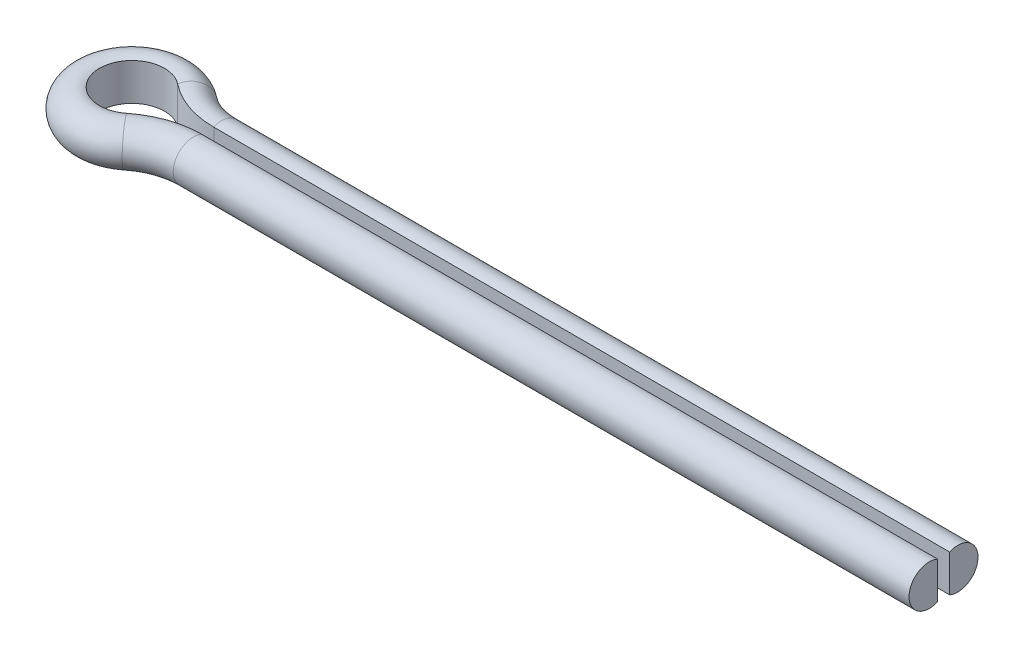
ISO-10303-21;
HEADER;
FILE_DESCRIPTION(('STEP AP214'),'2;1');
FILE_NAME('part.step','',(''),(''),'','','');
FILE_SCHEMA(('AUTOMOTIVE_DESIGN { 1 0 10303 214 1 1 1 1 }'));
ENDSEC;
DATA;
#1=APPLICATION_CONTEXT('core data for automotive mechanical design processes');
#2=APPLICATION_PROTOCOL_DEFINITION('international standard','automotive_design',2000,#1);
#3=PRODUCT_CONTEXT('',#1,'mechanical');
#4=PRODUCT('Part','Part','',(#3));
#5=PRODUCT_RELATED_PRODUCT_CATEGORY('part','',(#4));
#6=PRODUCT_DEFINITION_FORMATION('','',#4);
#7=PRODUCT_DEFINITION_CONTEXT('part definition',#1,'design');
#8=PRODUCT_DEFINITION('design','',#6,#7);
#9=PRODUCT_DEFINITION_SHAPE('','',#8);
#10=(LENGTH_UNIT() NAMED_UNIT(*) SI_UNIT(.MILLI.,.METRE.));
#11=(NAMED_UNIT(*) PLANE_ANGLE_UNIT() SI_UNIT($,.RADIAN.));
#12=(NAMED_UNIT(*) SI_UNIT($,.STERADIAN.) SOLID_ANGLE_UNIT());
#13=UNCERTAINTY_MEASURE_WITH_UNIT(LENGTH_MEASURE(1.E-05),#10,'distance_accuracy_value','');
#14=(GEOMETRIC_REPRESENTATION_CONTEXT(3) GLOBAL_UNCERTAINTY_ASSIGNED_CONTEXT((#13)) GLOBAL_UNIT_ASSIGNED_CONTEXT((#10,
#11,#12)) REPRESENTATION_CONTEXT('',''));
#15=CARTESIAN_POINT('',(0.,0.,0.));
#16=DIRECTION('',(0.,0.,1.));
#17=DIRECTION('',(1.,0.,0.));
#18=AXIS2_PLACEMENT_3D('',#15,#16,#17);
#19=CARTESIAN_POINT('',(100.,0.,1.75));
#20=DIRECTION('',(-1.,0.,0.));
#21=DIRECTION('',(0.,0.,1.));
#22=AXIS2_PLACEMENT_3D('',#19,#20,#21);
#23=PLANE('',#22);
#24=CARTESIAN_POINT('',(100.,0.,1.75));
#25=DIRECTION('',(-1.,0.,0.));
#26=DIRECTION('',(0.,0.,1.));
#27=AXIS2_PLACEMENT_3D('',#24,#25,#26);
#28=CIRCLE('',#27,2.5);
#29=CARTESIAN_POINT('',(100.,-2.29128784747792,0.749999999999998));
#30=VERTEX_POINT('',#29);
#31=CARTESIAN_POINT('',(100.,2.29128784747792,0.749999999999998));
#32=VERTEX_POINT('',#31);
#33=EDGE_CURVE('E86',#30,#32,#28,.T.);
#34=ORIENTED_EDGE('',*,*,#33,.F.);
#35=DIRECTION('',(0.,-1.,0.));
#36=VECTOR('',#35,1.);
#37=CARTESIAN_POINT('',(100.,-2.29128784747792,0.749999999999998));
#38=LINE('',#37,#36);
#39=EDGE_CURVE('E88',#32,#30,#38,.T.);
#40=ORIENTED_EDGE('',*,*,#39,.F.);
#41=EDGE_LOOP('',(#34,#40));
#42=FACE_BOUND('',#41,.T.);
#43=ADVANCED_FACE('F39',(#42),#23,.F.);
#44=CARTESIAN_POINT('',(100.,0.,-1.75));
#45=DIRECTION('',(1.,0.,0.));
#46=DIRECTION('',(0.,0.,-1.));
#47=AXIS2_PLACEMENT_3D('',#44,#45,#46);
#48=PLANE('',#47);
#49=CARTESIAN_POINT('',(100.,0.,-1.75));
#50=DIRECTION('',(1.,0.,0.));
#51=DIRECTION('',(0.,0.,-1.));
#52=AXIS2_PLACEMENT_3D('',#49,#50,#51);
#53=CIRCLE('',#52,2.5);
#54=CARTESIAN_POINT('',(100.,-2.29128784747792,-0.749999999999998));
#55=VERTEX_POINT('',#54);
#56=CARTESIAN_POINT('',(100.,2.29128784747792,-0.749999999999998));
#57=VERTEX_POINT('',#56);
#58=EDGE_CURVE('E52',#55,#57,#53,.T.);
#59=ORIENTED_EDGE('',*,*,#58,.T.);
#60=DIRECTION('',(0.,-1.,0.));
#61=VECTOR('',#60,1.);
#62=CARTESIAN_POINT('',(100.,-2.29128784747792,-0.749999999999998));
#63=LINE('',#62,#61);
#64=EDGE_CURVE('E11',#57,#55,#63,.T.);
#65=ORIENTED_EDGE('',*,*,#64,.T.);
#66=EDGE_LOOP('',(#59,#65));
#67=FACE_BOUND('',#66,.T.);
#68=ADVANCED_FACE('F212',(#67),#48,.T.);
#69=CARTESIAN_POINT('',(100.,0.,1.75));
#70=DIRECTION('',(-1.,0.,0.));
#71=DIRECTION('',(0.,0.,1.));
#72=AXIS2_PLACEMENT_3D('',#69,#70,#71);
#73=CYLINDRICAL_SURFACE('',#72,2.5);
#74=DIRECTION('',(-1.,0.,0.));
#75=VECTOR('',#74,1.);
#76=CARTESIAN_POINT('',(100.,2.29128784747792,0.749999999999998));
#77=LINE('',#76,#75);
#78=CARTESIAN_POINT('',(9.32402809948575,2.29128784747792,0.75));
#79=VERTEX_POINT('',#78);
#80=EDGE_CURVE('E100',#32,#79,#77,.T.);
#81=ORIENTED_EDGE('',*,*,#80,.T.);
#82=CARTESIAN_POINT('',(9.32402809948575,0.,1.75));
#83=DIRECTION('',(-1.,0.,0.));
#84=DIRECTION('',(0.,0.,1.));
#85=AXIS2_PLACEMENT_3D('',#82,#83,#84);
#86=CIRCLE('',#85,2.5);
#87=CARTESIAN_POINT('',(9.32402809948575,-2.29128784747792,0.75));
#88=VERTEX_POINT('',#87);
#89=EDGE_CURVE('E106',#88,#79,#86,.T.);
#90=ORIENTED_EDGE('',*,*,#89,.F.);
#91=DIRECTION('',(-1.,0.,0.));
#92=VECTOR('',#91,1.);
#93=CARTESIAN_POINT('',(100.,-2.29128784747792,0.749999999999998));
#94=LINE('',#93,#92);
#95=EDGE_CURVE('E99',#30,#88,#94,.T.);
#96=ORIENTED_EDGE('',*,*,#95,.F.);
#97=ORIENTED_EDGE('',*,*,#33,.T.);
#98=EDGE_LOOP('',(#81,#90,#96,#97));
#99=FACE_BOUND('',#98,.T.);
#100=ADVANCED_FACE('F104',(#99),#73,.T.);
#101=CARTESIAN_POINT('',(100.,-2.29128784747792,0.749999999999998));
#102=DIRECTION('',(0.,0.,-1.));
#103=DIRECTION('',(-1.,0.,0.));
#104=AXIS2_PLACEMENT_3D('',#101,#102,#103);
#105=PLANE('',#104);
#106=DIRECTION('',(0.,-1.,0.));
#107=VECTOR('',#106,1.);
#108=CARTESIAN_POINT('',(9.32402809948575,-2.29128784747792,0.75));
#109=LINE('',#108,#107);
#110=EDGE_CURVE('E126',#79,#88,#109,.T.);
#111=ORIENTED_EDGE('',*,*,#110,.F.);
#112=ORIENTED_EDGE('',*,*,#80,.F.);
#113=ORIENTED_EDGE('',*,*,#39,.T.);
#114=ORIENTED_EDGE('',*,*,#95,.T.);
#115=EDGE_LOOP('',(#111,#112,#113,#114));
#116=FACE_BOUND('',#115,.T.);
#117=ADVANCED_FACE('F98',(#116),#105,.T.);
#118=CARTESIAN_POINT('',(9.32402809948576,0.,11.75));
#119=DIRECTION('',(0.,1.,0.));
#120=DIRECTION('',(0.,0.,1.));
#121=AXIS2_PLACEMENT_3D('',#118,#119,#120);
#122=TOROIDAL_SURFACE('',#121,10.,2.5);
#123=CARTESIAN_POINT('',(9.32402809948576,2.29128784747792,11.75));
#124=DIRECTION('',(0.,1.,0.));
#125=DIRECTION('',(0.,0.,-1.));
#126=AXIS2_PLACEMENT_3D('',#123,#124,#125);
#127=CIRCLE('',#126,11.);
#128=CARTESIAN_POINT('',(2.48640749319621,2.29128784747792,3.13333333333333));
#129=VERTEX_POINT('',#128);
#130=EDGE_CURVE('E117',#79,#129,#127,.T.);
#131=ORIENTED_EDGE('',*,*,#130,.T.);
#132=CARTESIAN_POINT('',(3.10800936649526,0.,3.91666666666667));
#133=DIRECTION('',(-0.783333333333334,0.,0.62160187329905));
#134=DIRECTION('',(0.62160187329905,0.,0.783333333333334));
#135=AXIS2_PLACEMENT_3D('',#132,#133,#134);
#136=CIRCLE('',#135,2.5);
#137=CARTESIAN_POINT('',(2.48640749319621,-2.29128784747792,3.13333333333333));
#138=VERTEX_POINT('',#137);
#139=EDGE_CURVE('E113',#138,#129,#136,.T.);
#140=ORIENTED_EDGE('',*,*,#139,.F.);
#141=CARTESIAN_POINT('',(9.32402809948576,-2.29128784747792,11.75));
#142=DIRECTION('',(0.,1.,0.));
#143=DIRECTION('',(0.,0.,-1.));
#144=AXIS2_PLACEMENT_3D('',#141,#142,#143);
#145=CIRCLE('',#144,11.);
#146=EDGE_CURVE('E118',#88,#138,#145,.T.);
#147=ORIENTED_EDGE('',*,*,#146,.F.);
#148=ORIENTED_EDGE('',*,*,#89,.T.);
#149=EDGE_LOOP('',(#131,#140,#147,#148));
#150=FACE_BOUND('',#149,.T.);
#151=ADVANCED_FACE('F191',(#150),#122,.T.);
#152=CARTESIAN_POINT('',(9.32402809948576,0.,11.75));
#153=DIRECTION('',(0.,1.,0.));
#154=DIRECTION('',(0.,0.,1.));
#155=AXIS2_PLACEMENT_3D('',#152,#153,#154);
#156=CYLINDRICAL_SURFACE('',#155,11.);
#157=DIRECTION('',(0.,-1.,0.));
#158=VECTOR('',#157,1.);
#159=CARTESIAN_POINT('',(2.48640749319622,-2.29128784747792,3.13333333333334));
#160=LINE('',#159,#158);
#161=EDGE_CURVE('E122',#129,#138,#160,.T.);
#162=ORIENTED_EDGE('',*,*,#161,.F.);
#163=ORIENTED_EDGE('',*,*,#130,.F.);
#164=ORIENTED_EDGE('',*,*,#110,.T.);
#165=ORIENTED_EDGE('',*,*,#146,.T.);
#166=EDGE_LOOP('',(#162,#163,#164,#165));
#167=FACE_BOUND('',#166,.T.);
#168=ADVANCED_FACE('F192',(#167),#156,.T.);
#169=CARTESIAN_POINT('',(0.,0.,0.));
#170=DIRECTION('',(0.,-1.,0.));
#171=DIRECTION('',(0.,0.,-1.));
#172=AXIS2_PLACEMENT_3D('',#169,#170,#171);
#173=TOROIDAL_SURFACE('',#172,5.,2.5);
#174=CARTESIAN_POINT('',(0.,2.29128784747792,0.));
#175=DIRECTION('',(0.,-1.,0.));
#176=DIRECTION('',(0.621601873299052,0.,0.783333333333332));
#177=AXIS2_PLACEMENT_3D('',#174,#175,#176);
#178=CIRCLE('',#177,4.00000000000001);
#179=CARTESIAN_POINT('',(2.48640749319621,2.29128784747792,-3.13333333333334));
#180=VERTEX_POINT('',#179);
#181=EDGE_CURVE('E131',#129,#180,#178,.T.);
#182=ORIENTED_EDGE('',*,*,#181,.T.);
#183=CARTESIAN_POINT('',(3.10800936649525,0.,-3.91666666666666));
#184=DIRECTION('',(0.783333333333333,0.,0.621601873299051));
#185=DIRECTION('',(0.62160187329905,0.,-0.783333333333333));
#186=AXIS2_PLACEMENT_3D('',#183,#184,#185);
#187=CIRCLE('',#186,2.5);
#188=CARTESIAN_POINT('',(2.48640749319621,-2.29128784747792,-3.13333333333334));
#189=VERTEX_POINT('',#188);
#190=EDGE_CURVE('E127',#189,#180,#187,.T.);
#191=ORIENTED_EDGE('',*,*,#190,.F.);
#192=CARTESIAN_POINT('',(0.,-2.29128784747792,0.));
#193=DIRECTION('',(0.,-1.,0.));
#194=DIRECTION('',(0.621601873299052,0.,0.783333333333332));
#195=AXIS2_PLACEMENT_3D('',#192,#193,#194);
#196=CIRCLE('',#195,4.00000000000001);
#197=EDGE_CURVE('E132',#138,#189,#196,.T.);
#198=ORIENTED_EDGE('',*,*,#197,.F.);
#199=ORIENTED_EDGE('',*,*,#139,.T.);
#200=EDGE_LOOP('',(#182,#191,#198,#199));
#201=FACE_BOUND('',#200,.T.);
#202=ADVANCED_FACE('F185',(#201),#173,.T.);
#203=CARTESIAN_POINT('',(0.,0.,0.));
#204=DIRECTION('',(0.,-1.,0.));
#205=DIRECTION('',(0.,0.,-1.));
#206=AXIS2_PLACEMENT_3D('',#203,#204,#205);
#207=CYLINDRICAL_SURFACE('',#206,4.00000000000001);
#208=DIRECTION('',(0.,-1.,0.));
#209=VECTOR('',#208,1.);
#210=CARTESIAN_POINT('',(2.4864074931962,-2.29128784747792,-3.13333333333332));
#211=LINE('',#210,#209);
#212=EDGE_CURVE('E136',#180,#189,#211,.T.);
#213=ORIENTED_EDGE('',*,*,#212,.F.);
#214=ORIENTED_EDGE('',*,*,#181,.F.);
#215=ORIENTED_EDGE('',*,*,#161,.T.);
#216=ORIENTED_EDGE('',*,*,#197,.T.);
#217=EDGE_LOOP('',(#213,#214,#215,#216));
#218=FACE_BOUND('',#217,.T.);
#219=ADVANCED_FACE('F186',(#218),#207,.F.);
#220=CARTESIAN_POINT('',(9.32402809948576,0.,-11.75));
#221=DIRECTION('',(0.,1.,0.));
#222=DIRECTION('',(0.,0.,1.));
#223=AXIS2_PLACEMENT_3D('',#220,#221,#222);
#224=TOROIDAL_SURFACE('',#223,10.,2.5);
#225=CARTESIAN_POINT('',(9.32402809948576,2.29128784747792,-11.75));
#226=DIRECTION('',(0.,1.,0.));
#227=DIRECTION('',(-0.621601873299049,0.,0.783333333333334));
#228=AXIS2_PLACEMENT_3D('',#225,#226,#227);
#229=CIRCLE('',#228,11.);
#230=CARTESIAN_POINT('',(9.32402809948575,2.29128784747792,-0.750000000000001));
#231=VERTEX_POINT('',#230);
#232=EDGE_CURVE('E144',#180,#231,#229,.T.);
#233=ORIENTED_EDGE('',*,*,#232,.T.);
#234=CARTESIAN_POINT('',(9.32402809948575,0.,-1.75000000000002));
#235=DIRECTION('',(1.,0.,0.));
#236=DIRECTION('',(0.,0.,-1.));
#237=AXIS2_PLACEMENT_3D('',#234,#235,#236);
#238=CIRCLE('',#237,2.5);
#239=CARTESIAN_POINT('',(9.32402809948575,-2.29128784747792,-0.750000000000001));
#240=VERTEX_POINT('',#239);
#241=EDGE_CURVE('E140',#240,#231,#238,.T.);
#242=ORIENTED_EDGE('',*,*,#241,.F.);
#243=CARTESIAN_POINT('',(9.32402809948576,-2.29128784747792,-11.75));
#244=DIRECTION('',(0.,1.,0.));
#245=DIRECTION('',(-0.621601873299049,0.,0.783333333333334));
#246=AXIS2_PLACEMENT_3D('',#243,#244,#245);
#247=CIRCLE('',#246,11.);
#248=EDGE_CURVE('E145',#189,#240,#247,.T.);
#249=ORIENTED_EDGE('',*,*,#248,.F.);
#250=ORIENTED_EDGE('',*,*,#190,.T.);
#251=EDGE_LOOP('',(#233,#242,#249,#250));
#252=FACE_BOUND('',#251,.T.);
#253=ADVANCED_FACE('F178',(#252),#224,.T.);
#254=CARTESIAN_POINT('',(9.32402809948576,0.,-11.75));
#255=DIRECTION('',(0.,1.,0.));
#256=DIRECTION('',(0.,0.,1.));
#257=AXIS2_PLACEMENT_3D('',#254,#255,#256);
#258=CYLINDRICAL_SURFACE('',#257,11.);
#259=DIRECTION('',(0.,-1.,0.));
#260=VECTOR('',#259,1.);
#261=CARTESIAN_POINT('',(9.32402809948575,-2.29128784747792,-0.750000000000015));
#262=LINE('',#261,#260);
#263=EDGE_CURVE('E149',#231,#240,#262,.T.);
#264=ORIENTED_EDGE('',*,*,#263,.F.);
#265=ORIENTED_EDGE('',*,*,#232,.F.);
#266=ORIENTED_EDGE('',*,*,#212,.T.);
#267=ORIENTED_EDGE('',*,*,#248,.T.);
#268=EDGE_LOOP('',(#264,#265,#266,#267));
#269=FACE_BOUND('',#268,.T.);
#270=ADVANCED_FACE('F180',(#269),#258,.T.);
#271=CARTESIAN_POINT('',(9.32402809948575,0.,-1.75));
#272=DIRECTION('',(1.,0.,0.));
#273=DIRECTION('',(0.,0.,-1.));
#274=AXIS2_PLACEMENT_3D('',#271,#272,#273);
#275=CYLINDRICAL_SURFACE('',#274,2.5);
#276=DIRECTION('',(1.,0.,0.));
#277=VECTOR('',#276,1.);
#278=CARTESIAN_POINT('',(9.32402809948575,2.29128784747792,-0.75));
#279=LINE('',#278,#277);
#280=EDGE_CURVE('E47',#231,#57,#279,.T.);
#281=ORIENTED_EDGE('',*,*,#280,.T.);
#282=ORIENTED_EDGE('',*,*,#58,.F.);
#283=DIRECTION('',(1.,0.,0.));
#284=VECTOR('',#283,1.);
#285=CARTESIAN_POINT('',(9.32402809948575,-2.29128784747792,-0.75));
#286=LINE('',#285,#284);
#287=EDGE_CURVE('E155',#240,#55,#286,.T.);
#288=ORIENTED_EDGE('',*,*,#287,.F.);
#289=ORIENTED_EDGE('',*,*,#241,.T.);
#290=EDGE_LOOP('',(#281,#282,#288,#289));
#291=FACE_BOUND('',#290,.T.);
#292=ADVANCED_FACE('F205',(#291),#275,.T.);
#293=CARTESIAN_POINT('',(9.32402809948575,-2.29128784747792,-0.75));
#294=DIRECTION('',(0.,0.,1.));
#295=DIRECTION('',(1.,0.,0.));
#296=AXIS2_PLACEMENT_3D('',#293,#294,#295);
#297=PLANE('',#296);
#298=ORIENTED_EDGE('',*,*,#64,.F.);
#299=ORIENTED_EDGE('',*,*,#280,.F.);
#300=ORIENTED_EDGE('',*,*,#263,.T.);
#301=ORIENTED_EDGE('',*,*,#287,.T.);
#302=EDGE_LOOP('',(#298,#299,#300,#301));
#303=FACE_BOUND('',#302,.T.);
#304=ADVANCED_FACE('F175',(#303),#297,.T.);
#305=CLOSED_SHELL('',(#43,#68,#100,#117,#151,#168,#202,#219,#253,#270,#292,#304));
#306=MANIFOLD_SOLID_BREP('B2',#305);
#307=ADVANCED_BREP_SHAPE_REPRESENTATION('',(#18,#306),#14);
#308=SHAPE_DEFINITION_REPRESENTATION(#9,#307);
ENDSEC;
END-ISO-10303-21;
